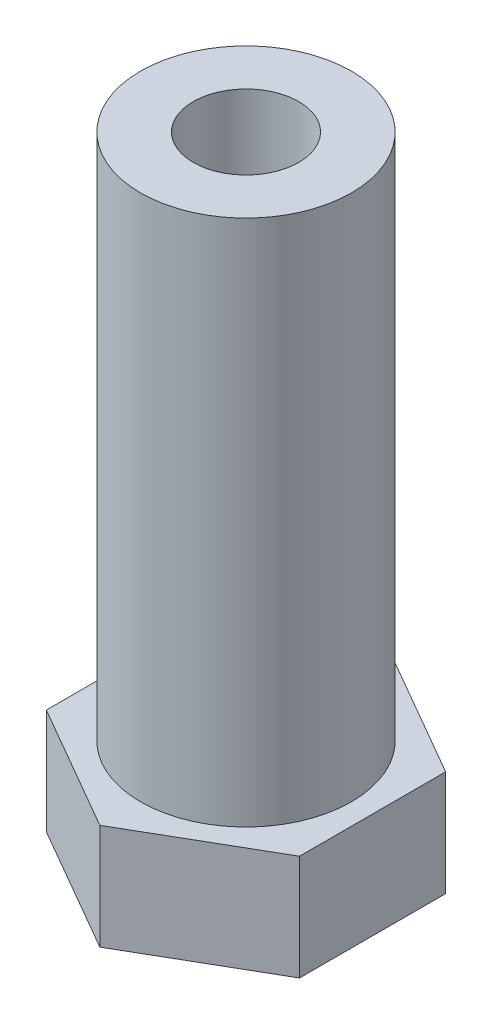
ISO-10303-21;
HEADER;
FILE_DESCRIPTION(('STEP AP214'),'2;1');
FILE_NAME('part.step','',(''),(''),'','','');
FILE_SCHEMA(('AUTOMOTIVE_DESIGN { 1 0 10303 214 1 1 1 1 }'));
ENDSEC;
DATA;
#1=APPLICATION_CONTEXT('core data for automotive mechanical design processes');
#2=APPLICATION_PROTOCOL_DEFINITION('international standard','automotive_design',2000,#1);
#3=PRODUCT_CONTEXT('',#1,'mechanical');
#4=PRODUCT('Part','Part','',(#3));
#5=PRODUCT_RELATED_PRODUCT_CATEGORY('part','',(#4));
#6=PRODUCT_DEFINITION_FORMATION('','',#4);
#7=PRODUCT_DEFINITION_CONTEXT('part definition',#1,'design');
#8=PRODUCT_DEFINITION('design','',#6,#7);
#9=PRODUCT_DEFINITION_SHAPE('','',#8);
#10=(LENGTH_UNIT() NAMED_UNIT(*) SI_UNIT(.MILLI.,.METRE.));
#11=(NAMED_UNIT(*) PLANE_ANGLE_UNIT() SI_UNIT($,.RADIAN.));
#12=(NAMED_UNIT(*) SI_UNIT($,.STERADIAN.) SOLID_ANGLE_UNIT());
#13=UNCERTAINTY_MEASURE_WITH_UNIT(LENGTH_MEASURE(1.E-05),#10,'distance_accuracy_value','');
#14=(GEOMETRIC_REPRESENTATION_CONTEXT(3) GLOBAL_UNCERTAINTY_ASSIGNED_CONTEXT((#13)) GLOBAL_UNIT_ASSIGNED_CONTEXT((#10,
#11,#12)) REPRESENTATION_CONTEXT('',''));
#15=CARTESIAN_POINT('',(0.,0.,0.));
#16=DIRECTION('',(0.,0.,1.));
#17=DIRECTION('',(1.,0.,0.));
#18=AXIS2_PLACEMENT_3D('',#15,#16,#17);
#19=CARTESIAN_POINT('',(0.,5.,0.));
#20=DIRECTION('',(0.,1.,0.));
#21=DIRECTION('',(0.,0.,1.));
#22=AXIS2_PLACEMENT_3D('',#19,#20,#21);
#23=PLANE('',#22);
#24=CARTESIAN_POINT('',(0.,5.,0.));
#25=DIRECTION('',(0.,1.,0.));
#26=DIRECTION('',(0.,0.,1.));
#27=AXIS2_PLACEMENT_3D('',#24,#25,#26);
#28=CIRCLE('',#27,2.);
#29=CARTESIAN_POINT('',(0.,5.,2.));
#30=VERTEX_POINT('',#29);
#31=EDGE_CURVE('E136',#30,#30,#28,.T.);
#32=ORIENTED_EDGE('',*,*,#31,.F.);
#33=EDGE_LOOP('',(#32));
#34=FACE_BOUND('',#33,.T.);
#35=CARTESIAN_POINT('',(0.,5.,0.));
#36=DIRECTION('',(0.,1.,0.));
#37=DIRECTION('',(0.,0.,1.));
#38=AXIS2_PLACEMENT_3D('',#35,#36,#37);
#39=CIRCLE('',#38,2.5);
#40=CARTESIAN_POINT('',(0.,5.,2.5));
#41=VERTEX_POINT('',#40);
#42=EDGE_CURVE('E187',#41,#41,#39,.T.);
#43=ORIENTED_EDGE('',*,*,#42,.T.);
#44=EDGE_LOOP('',(#43));
#45=FACE_BOUND('',#44,.T.);
#46=ADVANCED_FACE('F39',(#34,#45),#23,.T.);
#47=CARTESIAN_POINT('',(0.,5.,0.));
#48=DIRECTION('',(0.,1.,0.));
#49=DIRECTION('',(0.,0.,1.));
#50=AXIS2_PLACEMENT_3D('',#47,#48,#49);
#51=CIRCLE('',#50,5.);
#52=CARTESIAN_POINT('',(0.,5.,5.));
#53=VERTEX_POINT('',#52);
#54=EDGE_CURVE('E11',#53,#53,#51,.T.);
#55=ORIENTED_EDGE('',*,*,#54,.F.);
#56=EDGE_LOOP('',(#55));
#57=FACE_BOUND('',#56,.T.);
#58=DIRECTION('',(-0.866025403784441,0.,-0.499999999999995));
#59=VECTOR('',#58,1.);
#60=CARTESIAN_POINT('',(5.99999999999996,5.,-3.46410161513783));
#61=LINE('',#60,#59);
#62=CARTESIAN_POINT('',(5.99999999999996,5.,-3.46410161513783));
#63=VERTEX_POINT('',#62);
#64=CARTESIAN_POINT('',(0.,5.,-6.92820323027551));
#65=VERTEX_POINT('',#64);
#66=EDGE_CURVE('E148',#63,#65,#61,.T.);
#67=ORIENTED_EDGE('',*,*,#66,.T.);
#68=DIRECTION('',(-0.866025403784438,0.,0.500000000000001));
#69=VECTOR('',#68,1.);
#70=CARTESIAN_POINT('',(0.,5.,-6.92820323027551));
#71=LINE('',#70,#69);
#72=CARTESIAN_POINT('',(-6.00000000000001,5.,-3.46410161513774));
#73=VERTEX_POINT('',#72);
#74=EDGE_CURVE('E96',#65,#73,#71,.T.);
#75=ORIENTED_EDGE('',*,*,#74,.T.);
#76=DIRECTION('',(0.,0.,1.));
#77=VECTOR('',#76,1.);
#78=CARTESIAN_POINT('',(-6.00000000000001,5.,-3.46410161513774));
#79=LINE('',#78,#77);
#80=CARTESIAN_POINT('',(-5.99999999999999,5.,3.46410161513778));
#81=VERTEX_POINT('',#80);
#82=EDGE_CURVE('E109',#73,#81,#79,.T.);
#83=ORIENTED_EDGE('',*,*,#82,.T.);
#84=DIRECTION('',(0.866025403784442,0.,0.499999999999995));
#85=VECTOR('',#84,1.);
#86=CARTESIAN_POINT('',(-5.99999999999999,5.,3.46410161513778));
#87=LINE('',#86,#85);
#88=CARTESIAN_POINT('',(0.,5.,6.92820323027551));
#89=VERTEX_POINT('',#88);
#90=EDGE_CURVE('E103',#81,#89,#87,.T.);
#91=ORIENTED_EDGE('',*,*,#90,.T.);
#92=DIRECTION('',(0.866025403784435,0.,-0.500000000000007));
#93=VECTOR('',#92,1.);
#94=CARTESIAN_POINT('',(0.,5.,6.92820323027551));
#95=LINE('',#94,#93);
#96=CARTESIAN_POINT('',(6.00000000000004,5.,3.4641016151377));
#97=VERTEX_POINT('',#96);
#98=EDGE_CURVE('E107',#89,#97,#95,.T.);
#99=ORIENTED_EDGE('',*,*,#98,.T.);
#100=DIRECTION('',(0.,0.,-1.));
#101=VECTOR('',#100,1.);
#102=CARTESIAN_POINT('',(6.00000000000004,5.,3.4641016151377));
#103=LINE('',#102,#101);
#104=EDGE_CURVE('E58',#97,#63,#103,.T.);
#105=ORIENTED_EDGE('',*,*,#104,.T.);
#106=EDGE_LOOP('',(#67,#75,#83,#91,#99,#105));
#107=FACE_BOUND('',#106,.T.);
#108=ADVANCED_FACE('F105',(#57,#107),#23,.T.);
#109=CARTESIAN_POINT('',(0.,0.,0.));
#110=DIRECTION('',(0.,1.,0.));
#111=DIRECTION('',(0.,0.,1.));
#112=AXIS2_PLACEMENT_3D('',#109,#110,#111);
#113=PLANE('',#112);
#114=DIRECTION('',(-0.866025403784441,0.,-0.499999999999995));
#115=VECTOR('',#114,1.);
#116=CARTESIAN_POINT('',(5.99999999999996,0.,-3.46410161513783));
#117=LINE('',#116,#115);
#118=CARTESIAN_POINT('',(5.99999999999996,0.,-3.46410161513783));
#119=VERTEX_POINT('',#118);
#120=CARTESIAN_POINT('',(0.,0.,-6.92820323027551));
#121=VERTEX_POINT('',#120);
#122=EDGE_CURVE('E131',#119,#121,#117,.T.);
#123=ORIENTED_EDGE('',*,*,#122,.F.);
#124=DIRECTION('',(0.,0.,-1.));
#125=VECTOR('',#124,1.);
#126=CARTESIAN_POINT('',(6.00000000000004,0.,3.4641016151377));
#127=LINE('',#126,#125);
#128=CARTESIAN_POINT('',(6.00000000000004,0.,3.4641016151377));
#129=VERTEX_POINT('',#128);
#130=EDGE_CURVE('E87',#129,#119,#127,.T.);
#131=ORIENTED_EDGE('',*,*,#130,.F.);
#132=DIRECTION('',(0.866025403784435,0.,-0.500000000000007));
#133=VECTOR('',#132,1.);
#134=CARTESIAN_POINT('',(0.,0.,6.92820323027551));
#135=LINE('',#134,#133);
#136=CARTESIAN_POINT('',(0.,0.,6.92820323027551));
#137=VERTEX_POINT('',#136);
#138=EDGE_CURVE('E81',#137,#129,#135,.T.);
#139=ORIENTED_EDGE('',*,*,#138,.F.);
#140=DIRECTION('',(0.866025403784442,0.,0.499999999999995));
#141=VECTOR('',#140,1.);
#142=CARTESIAN_POINT('',(-5.99999999999999,0.,3.46410161513778));
#143=LINE('',#142,#141);
#144=CARTESIAN_POINT('',(-5.99999999999999,0.,3.46410161513778));
#145=VERTEX_POINT('',#144);
#146=EDGE_CURVE('E118',#145,#137,#143,.T.);
#147=ORIENTED_EDGE('',*,*,#146,.F.);
#148=DIRECTION('',(0.,0.,1.));
#149=VECTOR('',#148,1.);
#150=CARTESIAN_POINT('',(-6.00000000000001,0.,-3.46410161513774));
#151=LINE('',#150,#149);
#152=CARTESIAN_POINT('',(-6.00000000000001,0.,-3.46410161513774));
#153=VERTEX_POINT('',#152);
#154=EDGE_CURVE('E139',#153,#145,#151,.T.);
#155=ORIENTED_EDGE('',*,*,#154,.F.);
#156=DIRECTION('',(-0.866025403784438,0.,0.500000000000001));
#157=VECTOR('',#156,1.);
#158=CARTESIAN_POINT('',(0.,0.,-6.92820323027551));
#159=LINE('',#158,#157);
#160=EDGE_CURVE('E135',#121,#153,#159,.T.);
#161=ORIENTED_EDGE('',*,*,#160,.F.);
#162=EDGE_LOOP('',(#123,#131,#139,#147,#155,#161));
#163=FACE_BOUND('',#162,.T.);
#164=CARTESIAN_POINT('',(0.,0.,0.));
#165=DIRECTION('',(0.,1.,0.));
#166=DIRECTION('',(0.,0.,1.));
#167=AXIS2_PLACEMENT_3D('',#164,#165,#166);
#168=CIRCLE('',#167,2.);
#169=CARTESIAN_POINT('',(0.,0.,2.));
#170=VERTEX_POINT('',#169);
#171=EDGE_CURVE('E175',#170,#170,#168,.T.);
#172=ORIENTED_EDGE('',*,*,#171,.T.);
#173=EDGE_LOOP('',(#172));
#174=FACE_BOUND('',#173,.T.);
#175=ADVANCED_FACE('F166',(#163,#174),#113,.F.);
#176=CARTESIAN_POINT('',(5.99999999999996,5.,-3.46410161513783));
#177=DIRECTION('',(-0.499999999999995,0.,0.866025403784442));
#178=DIRECTION('',(0.866025403784442,0.,0.499999999999995));
#179=AXIS2_PLACEMENT_3D('',#176,#177,#178);
#180=PLANE('',#179);
#181=ORIENTED_EDGE('',*,*,#122,.T.);
#182=DIRECTION('',(0.,-1.,0.));
#183=VECTOR('',#182,1.);
#184=CARTESIAN_POINT('',(0.,5.,-6.92820323027551));
#185=LINE('',#184,#183);
#186=EDGE_CURVE('E43',#65,#121,#185,.T.);
#187=ORIENTED_EDGE('',*,*,#186,.F.);
#188=ORIENTED_EDGE('',*,*,#66,.F.);
#189=DIRECTION('',(0.,-1.,0.));
#190=VECTOR('',#189,1.);
#191=CARTESIAN_POINT('',(5.99999999999996,5.,-3.46410161513783));
#192=LINE('',#191,#190);
#193=EDGE_CURVE('E127',#63,#119,#192,.T.);
#194=ORIENTED_EDGE('',*,*,#193,.T.);
#195=EDGE_LOOP('',(#181,#187,#188,#194));
#196=FACE_BOUND('',#195,.T.);
#197=ADVANCED_FACE('F41',(#196),#180,.F.);
#198=CARTESIAN_POINT('',(0.,5.,-6.92820323027551));
#199=DIRECTION('',(0.500000000000001,0.,0.866025403784438));
#200=DIRECTION('',(0.866025403784438,0.,-0.500000000000001));
#201=AXIS2_PLACEMENT_3D('',#198,#199,#200);
#202=PLANE('',#201);
#203=ORIENTED_EDGE('',*,*,#160,.T.);
#204=DIRECTION('',(0.,-1.,0.));
#205=VECTOR('',#204,1.);
#206=CARTESIAN_POINT('',(-6.00000000000001,5.,-3.46410161513774));
#207=LINE('',#206,#205);
#208=EDGE_CURVE('E154',#73,#153,#207,.T.);
#209=ORIENTED_EDGE('',*,*,#208,.F.);
#210=ORIENTED_EDGE('',*,*,#74,.F.);
#211=ORIENTED_EDGE('',*,*,#186,.T.);
#212=EDGE_LOOP('',(#203,#209,#210,#211));
#213=FACE_BOUND('',#212,.T.);
#214=ADVANCED_FACE('F161',(#213),#202,.F.);
#215=CARTESIAN_POINT('',(-6.00000000000001,5.,-3.46410161513774));
#216=DIRECTION('',(1.,0.,0.));
#217=DIRECTION('',(0.,0.,-1.));
#218=AXIS2_PLACEMENT_3D('',#215,#216,#217);
#219=PLANE('',#218);
#220=ORIENTED_EDGE('',*,*,#154,.T.);
#221=DIRECTION('',(0.,-1.,0.));
#222=VECTOR('',#221,1.);
#223=CARTESIAN_POINT('',(-5.99999999999999,5.,3.46410161513778));
#224=LINE('',#223,#222);
#225=EDGE_CURVE('E120',#81,#145,#224,.T.);
#226=ORIENTED_EDGE('',*,*,#225,.F.);
#227=ORIENTED_EDGE('',*,*,#82,.F.);
#228=ORIENTED_EDGE('',*,*,#208,.T.);
#229=EDGE_LOOP('',(#220,#226,#227,#228));
#230=FACE_BOUND('',#229,.T.);
#231=ADVANCED_FACE('F168',(#230),#219,.F.);
#232=CARTESIAN_POINT('',(-5.99999999999999,5.,3.46410161513778));
#233=DIRECTION('',(0.499999999999995,0.,-0.866025403784442));
#234=DIRECTION('',(-0.866025403784442,0.,-0.499999999999995));
#235=AXIS2_PLACEMENT_3D('',#232,#233,#234);
#236=PLANE('',#235);
#237=ORIENTED_EDGE('',*,*,#146,.T.);
#238=DIRECTION('',(0.,-1.,0.));
#239=VECTOR('',#238,1.);
#240=CARTESIAN_POINT('',(0.,5.,6.92820323027551));
#241=LINE('',#240,#239);
#242=EDGE_CURVE('E115',#89,#137,#241,.T.);
#243=ORIENTED_EDGE('',*,*,#242,.F.);
#244=ORIENTED_EDGE('',*,*,#90,.F.);
#245=ORIENTED_EDGE('',*,*,#225,.T.);
#246=EDGE_LOOP('',(#237,#243,#244,#245));
#247=FACE_BOUND('',#246,.T.);
#248=ADVANCED_FACE('F116',(#247),#236,.F.);
#249=CARTESIAN_POINT('',(0.,5.,6.92820323027551));
#250=DIRECTION('',(-0.500000000000007,0.,-0.866025403784435));
#251=DIRECTION('',(-0.866025403784435,0.,0.500000000000007));
#252=AXIS2_PLACEMENT_3D('',#249,#250,#251);
#253=PLANE('',#252);
#254=ORIENTED_EDGE('',*,*,#138,.T.);
#255=DIRECTION('',(0.,-1.,0.));
#256=VECTOR('',#255,1.);
#257=CARTESIAN_POINT('',(6.00000000000004,5.,3.4641016151377));
#258=LINE('',#257,#256);
#259=EDGE_CURVE('E121',#97,#129,#258,.T.);
#260=ORIENTED_EDGE('',*,*,#259,.F.);
#261=ORIENTED_EDGE('',*,*,#98,.F.);
#262=ORIENTED_EDGE('',*,*,#242,.T.);
#263=EDGE_LOOP('',(#254,#260,#261,#262));
#264=FACE_BOUND('',#263,.T.);
#265=ADVANCED_FACE('F123',(#264),#253,.F.);
#266=CARTESIAN_POINT('',(6.00000000000004,5.,3.4641016151377));
#267=DIRECTION('',(-1.,0.,0.));
#268=DIRECTION('',(0.,0.,1.));
#269=AXIS2_PLACEMENT_3D('',#266,#267,#268);
#270=PLANE('',#269);
#271=ORIENTED_EDGE('',*,*,#130,.T.);
#272=ORIENTED_EDGE('',*,*,#193,.F.);
#273=ORIENTED_EDGE('',*,*,#104,.F.);
#274=ORIENTED_EDGE('',*,*,#259,.T.);
#275=EDGE_LOOP('',(#271,#272,#273,#274));
#276=FACE_BOUND('',#275,.T.);
#277=ADVANCED_FACE('F210',(#276),#270,.F.);
#278=CARTESIAN_POINT('',(0.,5.,0.));
#279=DIRECTION('',(0.,-1.,0.));
#280=DIRECTION('',(0.,0.,-1.));
#281=AXIS2_PLACEMENT_3D('',#278,#279,#280);
#282=CYLINDRICAL_SURFACE('',#281,2.);
#283=ORIENTED_EDGE('',*,*,#31,.T.);
#284=EDGE_LOOP('',(#283));
#285=FACE_BOUND('',#284,.T.);
#286=ORIENTED_EDGE('',*,*,#171,.F.);
#287=EDGE_LOOP('',(#286));
#288=FACE_BOUND('',#287,.T.);
#289=ADVANCED_FACE('F201',(#285,#288),#282,.F.);
#290=CARTESIAN_POINT('',(0.,30.,0.));
#291=DIRECTION('',(0.,1.,0.));
#292=DIRECTION('',(0.,0.,1.));
#293=AXIS2_PLACEMENT_3D('',#290,#291,#292);
#294=PLANE('',#293);
#295=CARTESIAN_POINT('',(0.,30.,0.));
#296=DIRECTION('',(0.,1.,0.));
#297=DIRECTION('',(0.,0.,1.));
#298=AXIS2_PLACEMENT_3D('',#295,#296,#297);
#299=CIRCLE('',#298,5.);
#300=CARTESIAN_POINT('',(0.,30.,5.));
#301=VERTEX_POINT('',#300);
#302=EDGE_CURVE('E179',#301,#301,#299,.T.);
#303=ORIENTED_EDGE('',*,*,#302,.T.);
#304=EDGE_LOOP('',(#303));
#305=FACE_BOUND('',#304,.T.);
#306=CARTESIAN_POINT('',(0.,30.,0.));
#307=DIRECTION('',(0.,1.,0.));
#308=DIRECTION('',(0.,0.,1.));
#309=AXIS2_PLACEMENT_3D('',#306,#307,#308);
#310=CIRCLE('',#309,2.5);
#311=CARTESIAN_POINT('',(0.,30.,2.5));
#312=VERTEX_POINT('',#311);
#313=EDGE_CURVE('E186',#312,#312,#310,.T.);
#314=ORIENTED_EDGE('',*,*,#313,.F.);
#315=EDGE_LOOP('',(#314));
#316=FACE_BOUND('',#315,.T.);
#317=ADVANCED_FACE('F198',(#305,#316),#294,.T.);
#318=CARTESIAN_POINT('',(0.,30.,0.));
#319=DIRECTION('',(0.,-1.,0.));
#320=DIRECTION('',(0.,0.,-1.));
#321=AXIS2_PLACEMENT_3D('',#318,#319,#320);
#322=CYLINDRICAL_SURFACE('',#321,5.);
#323=ORIENTED_EDGE('',*,*,#302,.F.);
#324=EDGE_LOOP('',(#323));
#325=FACE_BOUND('',#324,.T.);
#326=ORIENTED_EDGE('',*,*,#54,.T.);
#327=EDGE_LOOP('',(#326));
#328=FACE_BOUND('',#327,.T.);
#329=ADVANCED_FACE('F200',(#325,#328),#322,.T.);
#330=CARTESIAN_POINT('',(0.,30.,0.));
#331=DIRECTION('',(0.,-1.,0.));
#332=DIRECTION('',(0.,0.,-1.));
#333=AXIS2_PLACEMENT_3D('',#330,#331,#332);
#334=CYLINDRICAL_SURFACE('',#333,2.5);
#335=ORIENTED_EDGE('',*,*,#313,.T.);
#336=EDGE_LOOP('',(#335));
#337=FACE_BOUND('',#336,.T.);
#338=ORIENTED_EDGE('',*,*,#42,.F.);
#339=EDGE_LOOP('',(#338));
#340=FACE_BOUND('',#339,.T.);
#341=ADVANCED_FACE('F195',(#337,#340),#334,.F.);
#342=CLOSED_SHELL('',(#46,#108,#175,#197,#214,#231,#248,#265,#277,#289,#317,#329,#341));
#343=MANIFOLD_SOLID_BREP('B2',#342);
#344=ADVANCED_BREP_SHAPE_REPRESENTATION('',(#18,#343),#14);
#345=SHAPE_DEFINITION_REPRESENTATION(#9,#344);
ENDSEC;
END-ISO-10303-21;
